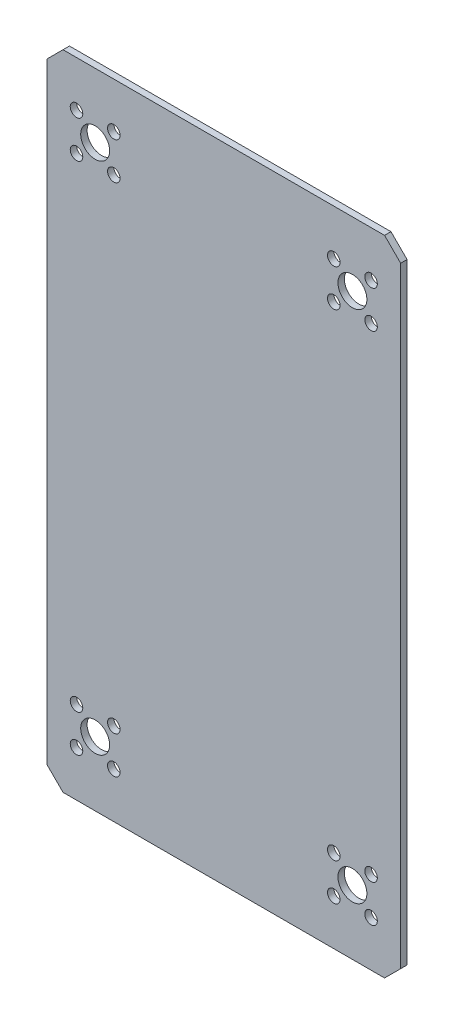
ISO-10303-21;
HEADER;
FILE_DESCRIPTION(('STEP AP214'),'2;1');
FILE_NAME('part.step','',(''),(''),'','','');
FILE_SCHEMA(('AUTOMOTIVE_DESIGN { 1 0 10303 214 1 1 1 1 }'));
ENDSEC;
DATA;
#1=APPLICATION_CONTEXT('core data for automotive mechanical design processes');
#2=APPLICATION_PROTOCOL_DEFINITION('international standard','automotive_design',2000,#1);
#3=PRODUCT_CONTEXT('',#1,'mechanical');
#4=PRODUCT('Part','Part','',(#3));
#5=PRODUCT_RELATED_PRODUCT_CATEGORY('part','',(#4));
#6=PRODUCT_DEFINITION_FORMATION('','',#4);
#7=PRODUCT_DEFINITION_CONTEXT('part definition',#1,'design');
#8=PRODUCT_DEFINITION('design','',#6,#7);
#9=PRODUCT_DEFINITION_SHAPE('','',#8);
#10=(LENGTH_UNIT() NAMED_UNIT(*) SI_UNIT(.MILLI.,.METRE.));
#11=(NAMED_UNIT(*) PLANE_ANGLE_UNIT() SI_UNIT($,.RADIAN.));
#12=(NAMED_UNIT(*) SI_UNIT($,.STERADIAN.) SOLID_ANGLE_UNIT());
#13=UNCERTAINTY_MEASURE_WITH_UNIT(LENGTH_MEASURE(1.E-05),#10,'distance_accuracy_value','');
#14=(GEOMETRIC_REPRESENTATION_CONTEXT(3) GLOBAL_UNCERTAINTY_ASSIGNED_CONTEXT((#13)) GLOBAL_UNIT_ASSIGNED_CONTEXT((#10,
#11,#12)) REPRESENTATION_CONTEXT('',''));
#15=CARTESIAN_POINT('',(0.,0.,0.));
#16=DIRECTION('',(0.,0.,1.));
#17=DIRECTION('',(1.,0.,0.));
#18=AXIS2_PLACEMENT_3D('',#15,#16,#17);
#19=CARTESIAN_POINT('',(55.,-100.,2.));
#20=DIRECTION('',(-1.,0.,0.));
#21=DIRECTION('',(0.,0.,1.));
#22=AXIS2_PLACEMENT_3D('',#19,#20,#21);
#23=PLANE('',#22);
#24=DIRECTION('',(0.,1.,0.));
#25=VECTOR('',#24,1.);
#26=CARTESIAN_POINT('',(55.,-100.,2.));
#27=LINE('',#26,#25);
#28=CARTESIAN_POINT('',(55.,-94.9999999999999,2.));
#29=VERTEX_POINT('',#28);
#30=CARTESIAN_POINT('',(55.,95.0000000000001,2.));
#31=VERTEX_POINT('',#30);
#32=EDGE_CURVE('E124',#29,#31,#27,.T.);
#33=ORIENTED_EDGE('',*,*,#32,.F.);
#34=DIRECTION('',(0.,0.,-1.));
#35=VECTOR('',#34,1.);
#36=CARTESIAN_POINT('',(55.,-94.9999999999999,2.));
#37=LINE('',#36,#35);
#38=CARTESIAN_POINT('',(55.,-94.9999999999999,0.));
#39=VERTEX_POINT('',#38);
#40=EDGE_CURVE('E150',#29,#39,#37,.T.);
#41=ORIENTED_EDGE('',*,*,#40,.T.);
#42=DIRECTION('',(0.,1.,0.));
#43=VECTOR('',#42,1.);
#44=CARTESIAN_POINT('',(55.,-100.,0.));
#45=LINE('',#44,#43);
#46=CARTESIAN_POINT('',(55.,95.0000000000001,0.));
#47=VERTEX_POINT('',#46);
#48=EDGE_CURVE('E156',#39,#47,#45,.T.);
#49=ORIENTED_EDGE('',*,*,#48,.T.);
#50=DIRECTION('',(0.,0.,1.));
#51=VECTOR('',#50,1.);
#52=CARTESIAN_POINT('',(55.,95.0000000000001,2.));
#53=LINE('',#52,#51);
#54=EDGE_CURVE('E148',#47,#31,#53,.T.);
#55=ORIENTED_EDGE('',*,*,#54,.T.);
#56=EDGE_LOOP('',(#33,#41,#49,#55));
#57=FACE_BOUND('',#56,.T.);
#58=ADVANCED_FACE('F32',(#57),#23,.F.);
#59=CARTESIAN_POINT('',(-55.,100.,2.));
#60=DIRECTION('',(0.,-1.,0.));
#61=DIRECTION('',(0.,0.,-1.));
#62=AXIS2_PLACEMENT_3D('',#59,#60,#61);
#63=PLANE('',#62);
#64=DIRECTION('',(-1.,0.,0.));
#65=VECTOR('',#64,1.);
#66=CARTESIAN_POINT('',(-55.,100.,2.));
#67=LINE('',#66,#65);
#68=CARTESIAN_POINT('',(50.,100.,2.));
#69=VERTEX_POINT('',#68);
#70=CARTESIAN_POINT('',(-49.9999999999999,100.,2.));
#71=VERTEX_POINT('',#70);
#72=EDGE_CURVE('E127',#69,#71,#67,.T.);
#73=ORIENTED_EDGE('',*,*,#72,.F.);
#74=DIRECTION('',(0.,0.,-1.));
#75=VECTOR('',#74,1.);
#76=CARTESIAN_POINT('',(50.,100.,2.));
#77=LINE('',#76,#75);
#78=CARTESIAN_POINT('',(50.,100.,0.));
#79=VERTEX_POINT('',#78);
#80=EDGE_CURVE('E11',#69,#79,#77,.T.);
#81=ORIENTED_EDGE('',*,*,#80,.T.);
#82=DIRECTION('',(-1.,0.,0.));
#83=VECTOR('',#82,1.);
#84=CARTESIAN_POINT('',(-55.,100.,0.));
#85=LINE('',#84,#83);
#86=CARTESIAN_POINT('',(-49.9999999999999,100.,0.));
#87=VERTEX_POINT('',#86);
#88=EDGE_CURVE('E129',#79,#87,#85,.T.);
#89=ORIENTED_EDGE('',*,*,#88,.T.);
#90=DIRECTION('',(0.,0.,1.));
#91=VECTOR('',#90,1.);
#92=CARTESIAN_POINT('',(-49.9999999999999,100.,2.));
#93=LINE('',#92,#91);
#94=EDGE_CURVE('E40',#87,#71,#93,.T.);
#95=ORIENTED_EDGE('',*,*,#94,.T.);
#96=EDGE_LOOP('',(#73,#81,#89,#95));
#97=FACE_BOUND('',#96,.T.);
#98=ADVANCED_FACE('F315',(#97),#63,.F.);
#99=CARTESIAN_POINT('',(-55.,-100.,2.));
#100=DIRECTION('',(1.,0.,0.));
#101=DIRECTION('',(0.,0.,-1.));
#102=AXIS2_PLACEMENT_3D('',#99,#100,#101);
#103=PLANE('',#102);
#104=DIRECTION('',(0.,-1.,0.));
#105=VECTOR('',#104,1.);
#106=CARTESIAN_POINT('',(-55.,-100.,0.));
#107=LINE('',#106,#105);
#108=CARTESIAN_POINT('',(-55.,95.,0.));
#109=VERTEX_POINT('',#108);
#110=CARTESIAN_POINT('',(-55.,-95.,0.));
#111=VERTEX_POINT('',#110);
#112=EDGE_CURVE('E125',#109,#111,#107,.T.);
#113=ORIENTED_EDGE('',*,*,#112,.T.);
#114=DIRECTION('',(0.,0.,1.));
#115=VECTOR('',#114,1.);
#116=CARTESIAN_POINT('',(-55.,-95.,2.));
#117=LINE('',#116,#115);
#118=CARTESIAN_POINT('',(-55.,-95.,2.));
#119=VERTEX_POINT('',#118);
#120=EDGE_CURVE('E103',#111,#119,#117,.T.);
#121=ORIENTED_EDGE('',*,*,#120,.T.);
#122=DIRECTION('',(0.,-1.,0.));
#123=VECTOR('',#122,1.);
#124=CARTESIAN_POINT('',(-55.,-100.,2.));
#125=LINE('',#124,#123);
#126=CARTESIAN_POINT('',(-55.,95.,2.));
#127=VERTEX_POINT('',#126);
#128=EDGE_CURVE('E168',#127,#119,#125,.T.);
#129=ORIENTED_EDGE('',*,*,#128,.F.);
#130=DIRECTION('',(0.,0.,-1.));
#131=VECTOR('',#130,1.);
#132=CARTESIAN_POINT('',(-55.,95.,2.));
#133=LINE('',#132,#131);
#134=EDGE_CURVE('E108',#127,#109,#133,.T.);
#135=ORIENTED_EDGE('',*,*,#134,.T.);
#136=EDGE_LOOP('',(#113,#121,#129,#135));
#137=FACE_BOUND('',#136,.T.);
#138=ADVANCED_FACE('F313',(#137),#103,.F.);
#139=CARTESIAN_POINT('',(-55.,-100.,2.));
#140=DIRECTION('',(0.,1.,0.));
#141=DIRECTION('',(0.,0.,1.));
#142=AXIS2_PLACEMENT_3D('',#139,#140,#141);
#143=PLANE('',#142);
#144=DIRECTION('',(1.,0.,0.));
#145=VECTOR('',#144,1.);
#146=CARTESIAN_POINT('',(-55.,-100.,2.));
#147=LINE('',#146,#145);
#148=CARTESIAN_POINT('',(-50.,-100.,2.));
#149=VERTEX_POINT('',#148);
#150=CARTESIAN_POINT('',(50.,-100.,2.));
#151=VERTEX_POINT('',#150);
#152=EDGE_CURVE('E118',#149,#151,#147,.T.);
#153=ORIENTED_EDGE('',*,*,#152,.F.);
#154=DIRECTION('',(0.,0.,-1.));
#155=VECTOR('',#154,1.);
#156=CARTESIAN_POINT('',(-50.,-100.,2.));
#157=LINE('',#156,#155);
#158=CARTESIAN_POINT('',(-50.,-100.,0.));
#159=VERTEX_POINT('',#158);
#160=EDGE_CURVE('E102',#149,#159,#157,.T.);
#161=ORIENTED_EDGE('',*,*,#160,.T.);
#162=DIRECTION('',(1.,0.,0.));
#163=VECTOR('',#162,1.);
#164=CARTESIAN_POINT('',(-55.,-100.,0.));
#165=LINE('',#164,#163);
#166=CARTESIAN_POINT('',(50.,-100.,0.));
#167=VERTEX_POINT('',#166);
#168=EDGE_CURVE('E115',#159,#167,#165,.T.);
#169=ORIENTED_EDGE('',*,*,#168,.T.);
#170=DIRECTION('',(0.,0.,1.));
#171=VECTOR('',#170,1.);
#172=CARTESIAN_POINT('',(50.,-100.,2.));
#173=LINE('',#172,#171);
#174=EDGE_CURVE('E120',#167,#151,#173,.T.);
#175=ORIENTED_EDGE('',*,*,#174,.T.);
#176=EDGE_LOOP('',(#153,#161,#169,#175));
#177=FACE_BOUND('',#176,.T.);
#178=ADVANCED_FACE('F114',(#177),#143,.F.);
#179=CARTESIAN_POINT('',(0.,0.,2.));
#180=DIRECTION('',(0.,0.,-1.));
#181=DIRECTION('',(-1.,0.,0.));
#182=AXIS2_PLACEMENT_3D('',#179,#180,#181);
#183=PLANE('',#182);
#184=CARTESIAN_POINT('',(45.8,-74.2,2.));
#185=DIRECTION('',(0.,0.,1.));
#186=DIRECTION('',(-1.,0.,0.));
#187=AXIS2_PLACEMENT_3D('',#184,#185,#186);
#188=CIRCLE('',#187,1.94999999999998);
#189=CARTESIAN_POINT('',(43.85,-74.2,2.));
#190=VERTEX_POINT('',#189);
#191=EDGE_CURVE('E235',#190,#190,#188,.T.);
#192=ORIENTED_EDGE('',*,*,#191,.F.);
#193=EDGE_LOOP('',(#192));
#194=FACE_BOUND('',#193,.T.);
#195=CARTESIAN_POINT('',(45.8,-85.8,2.));
#196=DIRECTION('',(0.,0.,1.));
#197=DIRECTION('',(1.,0.,0.));
#198=AXIS2_PLACEMENT_3D('',#195,#196,#197);
#199=CIRCLE('',#198,1.94999999999998);
#200=CARTESIAN_POINT('',(47.75,-85.8,2.));
#201=VERTEX_POINT('',#200);
#202=EDGE_CURVE('E242',#201,#201,#199,.T.);
#203=ORIENTED_EDGE('',*,*,#202,.F.);
#204=EDGE_LOOP('',(#203));
#205=FACE_BOUND('',#204,.T.);
#206=CARTESIAN_POINT('',(40.,-80.,2.));
#207=DIRECTION('',(0.,0.,1.));
#208=DIRECTION('',(1.,0.,0.));
#209=AXIS2_PLACEMENT_3D('',#206,#207,#208);
#210=CIRCLE('',#209,4.5);
#211=CARTESIAN_POINT('',(44.5,-80.,2.));
#212=VERTEX_POINT('',#211);
#213=EDGE_CURVE('E223',#212,#212,#210,.T.);
#214=ORIENTED_EDGE('',*,*,#213,.F.);
#215=EDGE_LOOP('',(#214));
#216=FACE_BOUND('',#215,.T.);
#217=CARTESIAN_POINT('',(40.,80.,2.));
#218=DIRECTION('',(0.,0.,1.));
#219=DIRECTION('',(-1.,0.,0.));
#220=AXIS2_PLACEMENT_3D('',#217,#218,#219);
#221=CIRCLE('',#220,4.5);
#222=CARTESIAN_POINT('',(35.5,80.,2.));
#223=VERTEX_POINT('',#222);
#224=EDGE_CURVE('E230',#223,#223,#221,.T.);
#225=ORIENTED_EDGE('',*,*,#224,.F.);
#226=EDGE_LOOP('',(#225));
#227=FACE_BOUND('',#226,.T.);
#228=CARTESIAN_POINT('',(34.2,-74.2,2.));
#229=DIRECTION('',(0.,0.,1.));
#230=DIRECTION('',(1.,0.,0.));
#231=AXIS2_PLACEMENT_3D('',#228,#229,#230);
#232=CIRCLE('',#231,1.94999999999999);
#233=CARTESIAN_POINT('',(36.15,-74.2,2.));
#234=VERTEX_POINT('',#233);
#235=EDGE_CURVE('E266',#234,#234,#232,.T.);
#236=ORIENTED_EDGE('',*,*,#235,.F.);
#237=EDGE_LOOP('',(#236));
#238=FACE_BOUND('',#237,.T.);
#239=CARTESIAN_POINT('',(34.2,-85.8,2.));
#240=DIRECTION('',(0.,0.,1.));
#241=DIRECTION('',(-1.,0.,0.));
#242=AXIS2_PLACEMENT_3D('',#239,#240,#241);
#243=CIRCLE('',#242,1.94999999999999);
#244=CARTESIAN_POINT('',(32.25,-85.8,2.));
#245=VERTEX_POINT('',#244);
#246=EDGE_CURVE('E260',#245,#245,#243,.T.);
#247=ORIENTED_EDGE('',*,*,#246,.F.);
#248=EDGE_LOOP('',(#247));
#249=FACE_BOUND('',#248,.T.);
#250=CARTESIAN_POINT('',(-34.2,-85.8,2.));
#251=DIRECTION('',(0.,0.,1.));
#252=DIRECTION('',(1.,0.,0.));
#253=AXIS2_PLACEMENT_3D('',#250,#251,#252);
#254=CIRCLE('',#253,1.94999999999999);
#255=CARTESIAN_POINT('',(-32.25,-85.8,2.));
#256=VERTEX_POINT('',#255);
#257=EDGE_CURVE('E254',#256,#256,#254,.T.);
#258=ORIENTED_EDGE('',*,*,#257,.F.);
#259=EDGE_LOOP('',(#258));
#260=FACE_BOUND('',#259,.T.);
#261=CARTESIAN_POINT('',(-34.2,-74.2,2.));
#262=DIRECTION('',(0.,0.,1.));
#263=DIRECTION('',(-1.,0.,0.));
#264=AXIS2_PLACEMENT_3D('',#261,#262,#263);
#265=CIRCLE('',#264,1.94999999999999);
#266=CARTESIAN_POINT('',(-36.15,-74.2,2.));
#267=VERTEX_POINT('',#266);
#268=EDGE_CURVE('E247',#267,#267,#265,.T.);
#269=ORIENTED_EDGE('',*,*,#268,.F.);
#270=EDGE_LOOP('',(#269));
#271=FACE_BOUND('',#270,.T.);
#272=CARTESIAN_POINT('',(45.8,85.8,2.));
#273=DIRECTION('',(0.,0.,1.));
#274=DIRECTION('',(-1.,0.,0.));
#275=AXIS2_PLACEMENT_3D('',#272,#273,#274);
#276=CIRCLE('',#275,1.94999999999998);
#277=CARTESIAN_POINT('',(43.85,85.8,2.));
#278=VERTEX_POINT('',#277);
#279=EDGE_CURVE('E175',#278,#278,#276,.T.);
#280=ORIENTED_EDGE('',*,*,#279,.F.);
#281=EDGE_LOOP('',(#280));
#282=FACE_BOUND('',#281,.T.);
#283=CARTESIAN_POINT('',(45.8,74.2,2.));
#284=DIRECTION('',(0.,0.,1.));
#285=DIRECTION('',(1.,0.,0.));
#286=AXIS2_PLACEMENT_3D('',#283,#284,#285);
#287=CIRCLE('',#286,1.94999999999998);
#288=CARTESIAN_POINT('',(47.75,74.2,2.));
#289=VERTEX_POINT('',#288);
#290=EDGE_CURVE('E182',#289,#289,#287,.T.);
#291=ORIENTED_EDGE('',*,*,#290,.F.);
#292=EDGE_LOOP('',(#291));
#293=FACE_BOUND('',#292,.T.);
#294=CARTESIAN_POINT('',(34.2,74.2,2.));
#295=DIRECTION('',(0.,0.,1.));
#296=DIRECTION('',(-1.,0.,0.));
#297=AXIS2_PLACEMENT_3D('',#294,#295,#296);
#298=CIRCLE('',#297,1.94999999999999);
#299=CARTESIAN_POINT('',(32.25,74.2,2.));
#300=VERTEX_POINT('',#299);
#301=EDGE_CURVE('E188',#300,#300,#298,.T.);
#302=ORIENTED_EDGE('',*,*,#301,.F.);
#303=EDGE_LOOP('',(#302));
#304=FACE_BOUND('',#303,.T.);
#305=CARTESIAN_POINT('',(34.2,85.8,2.));
#306=DIRECTION('',(0.,0.,1.));
#307=DIRECTION('',(1.,0.,0.));
#308=AXIS2_PLACEMENT_3D('',#305,#306,#307);
#309=CIRCLE('',#308,1.94999999999999);
#310=CARTESIAN_POINT('',(36.15,85.8,2.));
#311=VERTEX_POINT('',#310);
#312=EDGE_CURVE('E194',#311,#311,#309,.T.);
#313=ORIENTED_EDGE('',*,*,#312,.F.);
#314=EDGE_LOOP('',(#313));
#315=FACE_BOUND('',#314,.T.);
#316=CARTESIAN_POINT('',(-34.2,85.8,2.));
#317=DIRECTION('',(0.,0.,1.));
#318=DIRECTION('',(-1.,0.,0.));
#319=AXIS2_PLACEMENT_3D('',#316,#317,#318);
#320=CIRCLE('',#319,1.94999999999999);
#321=CARTESIAN_POINT('',(-36.15,85.8,2.));
#322=VERTEX_POINT('',#321);
#323=EDGE_CURVE('E200',#322,#322,#320,.T.);
#324=ORIENTED_EDGE('',*,*,#323,.F.);
#325=EDGE_LOOP('',(#324));
#326=FACE_BOUND('',#325,.T.);
#327=CARTESIAN_POINT('',(-34.2,74.2,2.));
#328=DIRECTION('',(0.,0.,1.));
#329=DIRECTION('',(1.,0.,0.));
#330=AXIS2_PLACEMENT_3D('',#327,#328,#329);
#331=CIRCLE('',#330,1.94999999999999);
#332=CARTESIAN_POINT('',(-32.25,74.2,2.));
#333=VERTEX_POINT('',#332);
#334=EDGE_CURVE('E206',#333,#333,#331,.T.);
#335=ORIENTED_EDGE('',*,*,#334,.F.);
#336=EDGE_LOOP('',(#335));
#337=FACE_BOUND('',#336,.T.);
#338=CARTESIAN_POINT('',(-45.8,74.2,2.));
#339=DIRECTION('',(0.,0.,1.));
#340=DIRECTION('',(-1.,0.,0.));
#341=AXIS2_PLACEMENT_3D('',#338,#339,#340);
#342=CIRCLE('',#341,1.94999999999998);
#343=CARTESIAN_POINT('',(-47.75,74.2,2.));
#344=VERTEX_POINT('',#343);
#345=EDGE_CURVE('E212',#344,#344,#342,.T.);
#346=ORIENTED_EDGE('',*,*,#345,.F.);
#347=EDGE_LOOP('',(#346));
#348=FACE_BOUND('',#347,.T.);
#349=CARTESIAN_POINT('',(-45.8,85.8,2.));
#350=DIRECTION('',(0.,0.,1.));
#351=DIRECTION('',(1.,0.,0.));
#352=AXIS2_PLACEMENT_3D('',#349,#350,#351);
#353=CIRCLE('',#352,1.94999999999998);
#354=CARTESIAN_POINT('',(-43.85,85.8,2.));
#355=VERTEX_POINT('',#354);
#356=EDGE_CURVE('E218',#355,#355,#353,.T.);
#357=ORIENTED_EDGE('',*,*,#356,.F.);
#358=EDGE_LOOP('',(#357));
#359=FACE_BOUND('',#358,.T.);
#360=CARTESIAN_POINT('',(-40.,-80.,2.));
#361=DIRECTION('',(0.,0.,1.));
#362=DIRECTION('',(-1.,0.,0.));
#363=AXIS2_PLACEMENT_3D('',#360,#361,#362);
#364=CIRCLE('',#363,4.50000000000001);
#365=CARTESIAN_POINT('',(-44.5000000000001,-80.,2.));
#366=VERTEX_POINT('',#365);
#367=EDGE_CURVE('E283',#366,#366,#364,.T.);
#368=ORIENTED_EDGE('',*,*,#367,.F.);
#369=EDGE_LOOP('',(#368));
#370=FACE_BOUND('',#369,.T.);
#371=CARTESIAN_POINT('',(-45.8,-85.8,2.));
#372=DIRECTION('',(0.,0.,1.));
#373=DIRECTION('',(-1.,0.,0.));
#374=AXIS2_PLACEMENT_3D('',#371,#372,#373);
#375=CIRCLE('',#374,1.94999999999998);
#376=CARTESIAN_POINT('',(-47.75,-85.8,2.));
#377=VERTEX_POINT('',#376);
#378=EDGE_CURVE('E271',#377,#377,#375,.T.);
#379=ORIENTED_EDGE('',*,*,#378,.F.);
#380=EDGE_LOOP('',(#379));
#381=FACE_BOUND('',#380,.T.);
#382=CARTESIAN_POINT('',(-45.8,-74.2,2.));
#383=DIRECTION('',(0.,0.,1.));
#384=DIRECTION('',(1.,0.,0.));
#385=AXIS2_PLACEMENT_3D('',#382,#383,#384);
#386=CIRCLE('',#385,1.94999999999998);
#387=CARTESIAN_POINT('',(-43.85,-74.2,2.));
#388=VERTEX_POINT('',#387);
#389=EDGE_CURVE('E278',#388,#388,#386,.T.);
#390=ORIENTED_EDGE('',*,*,#389,.F.);
#391=EDGE_LOOP('',(#390));
#392=FACE_BOUND('',#391,.T.);
#393=CARTESIAN_POINT('',(-40.,80.,2.));
#394=DIRECTION('',(0.,0.,1.));
#395=DIRECTION('',(1.,0.,0.));
#396=AXIS2_PLACEMENT_3D('',#393,#394,#395);
#397=CIRCLE('',#396,4.50000000000001);
#398=CARTESIAN_POINT('',(-35.5,80.,2.));
#399=VERTEX_POINT('',#398);
#400=EDGE_CURVE('E164',#399,#399,#397,.T.);
#401=ORIENTED_EDGE('',*,*,#400,.F.);
#402=EDGE_LOOP('',(#401));
#403=FACE_BOUND('',#402,.T.);
#404=ORIENTED_EDGE('',*,*,#128,.T.);
#405=DIRECTION('',(-0.707106781186548,0.707106781186548,0.));
#406=VECTOR('',#405,1.);
#407=CARTESIAN_POINT('',(-50.,-100.,2.));
#408=LINE('',#407,#406);
#409=EDGE_CURVE('E146',#119,#149,#408,.F.);
#410=ORIENTED_EDGE('',*,*,#409,.T.);
#411=ORIENTED_EDGE('',*,*,#152,.T.);
#412=DIRECTION('',(-0.707106781186548,-0.707106781186548,0.));
#413=VECTOR('',#412,1.);
#414=CARTESIAN_POINT('',(55.,-94.9999999999999,2.));
#415=LINE('',#414,#413);
#416=EDGE_CURVE('E144',#151,#29,#415,.F.);
#417=ORIENTED_EDGE('',*,*,#416,.T.);
#418=ORIENTED_EDGE('',*,*,#32,.T.);
#419=DIRECTION('',(0.707106781186548,-0.707106781186548,0.));
#420=VECTOR('',#419,1.);
#421=CARTESIAN_POINT('',(50.,100.,2.));
#422=LINE('',#421,#420);
#423=EDGE_CURVE('E53',#31,#69,#422,.F.);
#424=ORIENTED_EDGE('',*,*,#423,.T.);
#425=ORIENTED_EDGE('',*,*,#72,.T.);
#426=DIRECTION('',(0.707106781186548,0.707106781186548,0.));
#427=VECTOR('',#426,1.);
#428=CARTESIAN_POINT('',(-55.,95.,2.));
#429=LINE('',#428,#427);
#430=EDGE_CURVE('E141',#71,#127,#429,.F.);
#431=ORIENTED_EDGE('',*,*,#430,.T.);
#432=EDGE_LOOP('',(#404,#410,#411,#417,#418,#424,#425,#431));
#433=FACE_BOUND('',#432,.T.);
#434=ADVANCED_FACE('F299',(#194,#205,#216,#227,#238,#249,#260,#271,#282,#293,#304,#315,#326,
#337,#348,#359,#370,#381,#392,#403,#433),#183,.F.);
#435=CARTESIAN_POINT('',(0.,0.,0.));
#436=DIRECTION('',(0.,0.,-1.));
#437=DIRECTION('',(-1.,0.,0.));
#438=AXIS2_PLACEMENT_3D('',#435,#436,#437);
#439=PLANE('',#438);
#440=CARTESIAN_POINT('',(45.8,-74.2,0.));
#441=DIRECTION('',(0.,0.,1.));
#442=DIRECTION('',(-1.,0.,0.));
#443=AXIS2_PLACEMENT_3D('',#440,#441,#442);
#444=CIRCLE('',#443,1.94999999999998);
#445=CARTESIAN_POINT('',(43.85,-74.2,0.));
#446=VERTEX_POINT('',#445);
#447=EDGE_CURVE('E238',#446,#446,#444,.T.);
#448=ORIENTED_EDGE('',*,*,#447,.T.);
#449=EDGE_LOOP('',(#448));
#450=FACE_BOUND('',#449,.T.);
#451=CARTESIAN_POINT('',(45.8,-85.8,0.));
#452=DIRECTION('',(0.,0.,1.));
#453=DIRECTION('',(1.,0.,0.));
#454=AXIS2_PLACEMENT_3D('',#451,#452,#453);
#455=CIRCLE('',#454,1.94999999999998);
#456=CARTESIAN_POINT('',(47.75,-85.8,0.));
#457=VERTEX_POINT('',#456);
#458=EDGE_CURVE('E227',#457,#457,#455,.T.);
#459=ORIENTED_EDGE('',*,*,#458,.T.);
#460=EDGE_LOOP('',(#459));
#461=FACE_BOUND('',#460,.T.);
#462=CARTESIAN_POINT('',(40.,-80.,0.));
#463=DIRECTION('',(0.,0.,1.));
#464=DIRECTION('',(1.,0.,0.));
#465=AXIS2_PLACEMENT_3D('',#462,#463,#464);
#466=CIRCLE('',#465,4.5);
#467=CARTESIAN_POINT('',(44.5,-80.,0.));
#468=VERTEX_POINT('',#467);
#469=EDGE_CURVE('E226',#468,#468,#466,.T.);
#470=ORIENTED_EDGE('',*,*,#469,.T.);
#471=EDGE_LOOP('',(#470));
#472=FACE_BOUND('',#471,.T.);
#473=CARTESIAN_POINT('',(40.,80.,0.));
#474=DIRECTION('',(0.,0.,1.));
#475=DIRECTION('',(-1.,0.,0.));
#476=AXIS2_PLACEMENT_3D('',#473,#474,#475);
#477=CIRCLE('',#476,4.5);
#478=CARTESIAN_POINT('',(35.5,80.,0.));
#479=VERTEX_POINT('',#478);
#480=EDGE_CURVE('E179',#479,#479,#477,.T.);
#481=ORIENTED_EDGE('',*,*,#480,.T.);
#482=EDGE_LOOP('',(#481));
#483=FACE_BOUND('',#482,.T.);
#484=CARTESIAN_POINT('',(34.2,-74.2,0.));
#485=DIRECTION('',(0.,0.,1.));
#486=DIRECTION('',(1.,0.,0.));
#487=AXIS2_PLACEMENT_3D('',#484,#485,#486);
#488=CIRCLE('',#487,1.94999999999999);
#489=CARTESIAN_POINT('',(36.15,-74.2,0.));
#490=VERTEX_POINT('',#489);
#491=EDGE_CURVE('E239',#490,#490,#488,.T.);
#492=ORIENTED_EDGE('',*,*,#491,.T.);
#493=EDGE_LOOP('',(#492));
#494=FACE_BOUND('',#493,.T.);
#495=CARTESIAN_POINT('',(34.2,-85.8,0.));
#496=DIRECTION('',(0.,0.,1.));
#497=DIRECTION('',(-1.,0.,0.));
#498=AXIS2_PLACEMENT_3D('',#495,#496,#497);
#499=CIRCLE('',#498,1.94999999999999);
#500=CARTESIAN_POINT('',(32.25,-85.8,0.));
#501=VERTEX_POINT('',#500);
#502=EDGE_CURVE('E263',#501,#501,#499,.T.);
#503=ORIENTED_EDGE('',*,*,#502,.T.);
#504=EDGE_LOOP('',(#503));
#505=FACE_BOUND('',#504,.T.);
#506=CARTESIAN_POINT('',(-34.2,-85.8,0.));
#507=DIRECTION('',(0.,0.,1.));
#508=DIRECTION('',(1.,0.,0.));
#509=AXIS2_PLACEMENT_3D('',#506,#507,#508);
#510=CIRCLE('',#509,1.94999999999999);
#511=CARTESIAN_POINT('',(-32.25,-85.8,0.));
#512=VERTEX_POINT('',#511);
#513=EDGE_CURVE('E257',#512,#512,#510,.T.);
#514=ORIENTED_EDGE('',*,*,#513,.T.);
#515=EDGE_LOOP('',(#514));
#516=FACE_BOUND('',#515,.T.);
#517=CARTESIAN_POINT('',(-34.2,-74.2,0.));
#518=DIRECTION('',(0.,0.,1.));
#519=DIRECTION('',(-1.,0.,0.));
#520=AXIS2_PLACEMENT_3D('',#517,#518,#519);
#521=CIRCLE('',#520,1.94999999999999);
#522=CARTESIAN_POINT('',(-36.15,-74.2,0.));
#523=VERTEX_POINT('',#522);
#524=EDGE_CURVE('E250',#523,#523,#521,.T.);
#525=ORIENTED_EDGE('',*,*,#524,.T.);
#526=EDGE_LOOP('',(#525));
#527=FACE_BOUND('',#526,.T.);
#528=CARTESIAN_POINT('',(45.8,85.8,0.));
#529=DIRECTION('',(0.,0.,1.));
#530=DIRECTION('',(-1.,0.,0.));
#531=AXIS2_PLACEMENT_3D('',#528,#529,#530);
#532=CIRCLE('',#531,1.94999999999998);
#533=CARTESIAN_POINT('',(43.85,85.8,0.));
#534=VERTEX_POINT('',#533);
#535=EDGE_CURVE('E178',#534,#534,#532,.T.);
#536=ORIENTED_EDGE('',*,*,#535,.T.);
#537=EDGE_LOOP('',(#536));
#538=FACE_BOUND('',#537,.T.);
#539=CARTESIAN_POINT('',(45.8,74.2,0.));
#540=DIRECTION('',(0.,0.,1.));
#541=DIRECTION('',(1.,0.,0.));
#542=AXIS2_PLACEMENT_3D('',#539,#540,#541);
#543=CIRCLE('',#542,1.94999999999998);
#544=CARTESIAN_POINT('',(47.75,74.2,0.));
#545=VERTEX_POINT('',#544);
#546=EDGE_CURVE('E185',#545,#545,#543,.T.);
#547=ORIENTED_EDGE('',*,*,#546,.T.);
#548=EDGE_LOOP('',(#547));
#549=FACE_BOUND('',#548,.T.);
#550=CARTESIAN_POINT('',(34.2,74.2,0.));
#551=DIRECTION('',(0.,0.,1.));
#552=DIRECTION('',(-1.,0.,0.));
#553=AXIS2_PLACEMENT_3D('',#550,#551,#552);
#554=CIRCLE('',#553,1.94999999999999);
#555=CARTESIAN_POINT('',(32.25,74.2,0.));
#556=VERTEX_POINT('',#555);
#557=EDGE_CURVE('E191',#556,#556,#554,.T.);
#558=ORIENTED_EDGE('',*,*,#557,.T.);
#559=EDGE_LOOP('',(#558));
#560=FACE_BOUND('',#559,.T.);
#561=CARTESIAN_POINT('',(34.2,85.8,0.));
#562=DIRECTION('',(0.,0.,1.));
#563=DIRECTION('',(1.,0.,0.));
#564=AXIS2_PLACEMENT_3D('',#561,#562,#563);
#565=CIRCLE('',#564,1.94999999999999);
#566=CARTESIAN_POINT('',(36.15,85.8,0.));
#567=VERTEX_POINT('',#566);
#568=EDGE_CURVE('E197',#567,#567,#565,.T.);
#569=ORIENTED_EDGE('',*,*,#568,.T.);
#570=EDGE_LOOP('',(#569));
#571=FACE_BOUND('',#570,.T.);
#572=CARTESIAN_POINT('',(-34.2,85.8,0.));
#573=DIRECTION('',(0.,0.,1.));
#574=DIRECTION('',(-1.,0.,0.));
#575=AXIS2_PLACEMENT_3D('',#572,#573,#574);
#576=CIRCLE('',#575,1.94999999999999);
#577=CARTESIAN_POINT('',(-36.15,85.8,0.));
#578=VERTEX_POINT('',#577);
#579=EDGE_CURVE('E203',#578,#578,#576,.T.);
#580=ORIENTED_EDGE('',*,*,#579,.T.);
#581=EDGE_LOOP('',(#580));
#582=FACE_BOUND('',#581,.T.);
#583=CARTESIAN_POINT('',(-34.2,74.2,0.));
#584=DIRECTION('',(0.,0.,1.));
#585=DIRECTION('',(1.,0.,0.));
#586=AXIS2_PLACEMENT_3D('',#583,#584,#585);
#587=CIRCLE('',#586,1.94999999999999);
#588=CARTESIAN_POINT('',(-32.25,74.2,0.));
#589=VERTEX_POINT('',#588);
#590=EDGE_CURVE('E209',#589,#589,#587,.T.);
#591=ORIENTED_EDGE('',*,*,#590,.T.);
#592=EDGE_LOOP('',(#591));
#593=FACE_BOUND('',#592,.T.);
#594=CARTESIAN_POINT('',(-45.8,74.2,0.));
#595=DIRECTION('',(0.,0.,1.));
#596=DIRECTION('',(-1.,0.,0.));
#597=AXIS2_PLACEMENT_3D('',#594,#595,#596);
#598=CIRCLE('',#597,1.94999999999998);
#599=CARTESIAN_POINT('',(-47.75,74.2,0.));
#600=VERTEX_POINT('',#599);
#601=EDGE_CURVE('E215',#600,#600,#598,.T.);
#602=ORIENTED_EDGE('',*,*,#601,.T.);
#603=EDGE_LOOP('',(#602));
#604=FACE_BOUND('',#603,.T.);
#605=CARTESIAN_POINT('',(-45.8,85.8,0.));
#606=DIRECTION('',(0.,0.,1.));
#607=DIRECTION('',(1.,0.,0.));
#608=AXIS2_PLACEMENT_3D('',#605,#606,#607);
#609=CIRCLE('',#608,1.94999999999998);
#610=CARTESIAN_POINT('',(-43.85,85.8,0.));
#611=VERTEX_POINT('',#610);
#612=EDGE_CURVE('E173',#611,#611,#609,.T.);
#613=ORIENTED_EDGE('',*,*,#612,.T.);
#614=EDGE_LOOP('',(#613));
#615=FACE_BOUND('',#614,.T.);
#616=CARTESIAN_POINT('',(-40.,-80.,0.));
#617=DIRECTION('',(0.,0.,1.));
#618=DIRECTION('',(-1.,0.,0.));
#619=AXIS2_PLACEMENT_3D('',#616,#617,#618);
#620=CIRCLE('',#619,4.50000000000001);
#621=CARTESIAN_POINT('',(-44.5000000000001,-80.,0.));
#622=VERTEX_POINT('',#621);
#623=EDGE_CURVE('E275',#622,#622,#620,.T.);
#624=ORIENTED_EDGE('',*,*,#623,.T.);
#625=EDGE_LOOP('',(#624));
#626=FACE_BOUND('',#625,.T.);
#627=CARTESIAN_POINT('',(-45.8,-85.8,0.));
#628=DIRECTION('',(0.,0.,1.));
#629=DIRECTION('',(-1.,0.,0.));
#630=AXIS2_PLACEMENT_3D('',#627,#628,#629);
#631=CIRCLE('',#630,1.94999999999998);
#632=CARTESIAN_POINT('',(-47.75,-85.8,0.));
#633=VERTEX_POINT('',#632);
#634=EDGE_CURVE('E274',#633,#633,#631,.T.);
#635=ORIENTED_EDGE('',*,*,#634,.T.);
#636=EDGE_LOOP('',(#635));
#637=FACE_BOUND('',#636,.T.);
#638=CARTESIAN_POINT('',(-45.8,-74.2,0.));
#639=DIRECTION('',(0.,0.,1.));
#640=DIRECTION('',(1.,0.,0.));
#641=AXIS2_PLACEMENT_3D('',#638,#639,#640);
#642=CIRCLE('',#641,1.94999999999998);
#643=CARTESIAN_POINT('',(-43.85,-74.2,0.));
#644=VERTEX_POINT('',#643);
#645=EDGE_CURVE('E251',#644,#644,#642,.T.);
#646=ORIENTED_EDGE('',*,*,#645,.T.);
#647=EDGE_LOOP('',(#646));
#648=FACE_BOUND('',#647,.T.);
#649=CARTESIAN_POINT('',(-40.,80.,0.));
#650=DIRECTION('',(0.,0.,1.));
#651=DIRECTION('',(1.,0.,0.));
#652=AXIS2_PLACEMENT_3D('',#649,#650,#651);
#653=CIRCLE('',#652,4.50000000000001);
#654=CARTESIAN_POINT('',(-35.5,80.,0.));
#655=VERTEX_POINT('',#654);
#656=EDGE_CURVE('E161',#655,#655,#653,.T.);
#657=ORIENTED_EDGE('',*,*,#656,.T.);
#658=EDGE_LOOP('',(#657));
#659=FACE_BOUND('',#658,.T.);
#660=ORIENTED_EDGE('',*,*,#168,.F.);
#661=DIRECTION('',(0.707106781186548,-0.707106781186548,0.));
#662=VECTOR('',#661,1.);
#663=CARTESIAN_POINT('',(-75.,-75.,0.));
#664=LINE('',#663,#662);
#665=EDGE_CURVE('E98',#159,#111,#664,.F.);
#666=ORIENTED_EDGE('',*,*,#665,.T.);
#667=ORIENTED_EDGE('',*,*,#112,.F.);
#668=DIRECTION('',(-0.707106781186548,-0.707106781186548,0.));
#669=VECTOR('',#668,1.);
#670=CARTESIAN_POINT('',(-75.,75.,0.));
#671=LINE('',#670,#669);
#672=EDGE_CURVE('E119',#109,#87,#671,.F.);
#673=ORIENTED_EDGE('',*,*,#672,.T.);
#674=ORIENTED_EDGE('',*,*,#88,.F.);
#675=DIRECTION('',(-0.707106781186548,0.707106781186548,0.));
#676=VECTOR('',#675,1.);
#677=CARTESIAN_POINT('',(75.,75.,0.));
#678=LINE('',#677,#676);
#679=EDGE_CURVE('E135',#79,#47,#678,.F.);
#680=ORIENTED_EDGE('',*,*,#679,.T.);
#681=ORIENTED_EDGE('',*,*,#48,.F.);
#682=DIRECTION('',(0.707106781186548,0.707106781186548,0.));
#683=VECTOR('',#682,1.);
#684=CARTESIAN_POINT('',(75.,-75.,0.));
#685=LINE('',#684,#683);
#686=EDGE_CURVE('E109',#39,#167,#685,.F.);
#687=ORIENTED_EDGE('',*,*,#686,.T.);
#688=EDGE_LOOP('',(#660,#666,#667,#673,#674,#680,#681,#687));
#689=FACE_BOUND('',#688,.T.);
#690=ADVANCED_FACE('F122',(#450,#461,#472,#483,#494,#505,#516,#527,#538,#549,#560,#571,#582,
#593,#604,#615,#626,#637,#648,#659,#689),#439,.T.);
#691=CARTESIAN_POINT('',(-40.,80.,0.));
#692=DIRECTION('',(0.,0.,1.));
#693=DIRECTION('',(1.,0.,0.));
#694=AXIS2_PLACEMENT_3D('',#691,#692,#693);
#695=CYLINDRICAL_SURFACE('',#694,4.50000000000001);
#696=ORIENTED_EDGE('',*,*,#656,.F.);
#697=EDGE_LOOP('',(#696));
#698=FACE_BOUND('',#697,.T.);
#699=ORIENTED_EDGE('',*,*,#400,.T.);
#700=EDGE_LOOP('',(#699));
#701=FACE_BOUND('',#700,.T.);
#702=ADVANCED_FACE('F340',(#698,#701),#695,.F.);
#703=CARTESIAN_POINT('',(-45.8,-74.2,0.));
#704=DIRECTION('',(0.,0.,1.));
#705=DIRECTION('',(1.,0.,0.));
#706=AXIS2_PLACEMENT_3D('',#703,#704,#705);
#707=CYLINDRICAL_SURFACE('',#706,1.94999999999998);
#708=ORIENTED_EDGE('',*,*,#645,.F.);
#709=EDGE_LOOP('',(#708));
#710=FACE_BOUND('',#709,.T.);
#711=ORIENTED_EDGE('',*,*,#389,.T.);
#712=EDGE_LOOP('',(#711));
#713=FACE_BOUND('',#712,.T.);
#714=ADVANCED_FACE('F345',(#710,#713),#707,.F.);
#715=CARTESIAN_POINT('',(-45.8,-85.8,0.));
#716=DIRECTION('',(0.,0.,1.));
#717=DIRECTION('',(1.,0.,0.));
#718=AXIS2_PLACEMENT_3D('',#715,#716,#717);
#719=CYLINDRICAL_SURFACE('',#718,1.94999999999998);
#720=ORIENTED_EDGE('',*,*,#634,.F.);
#721=EDGE_LOOP('',(#720));
#722=FACE_BOUND('',#721,.T.);
#723=ORIENTED_EDGE('',*,*,#378,.T.);
#724=EDGE_LOOP('',(#723));
#725=FACE_BOUND('',#724,.T.);
#726=ADVANCED_FACE('F295',(#722,#725),#719,.F.);
#727=CARTESIAN_POINT('',(-40.,-80.,0.));
#728=DIRECTION('',(0.,0.,1.));
#729=DIRECTION('',(1.,0.,0.));
#730=AXIS2_PLACEMENT_3D('',#727,#728,#729);
#731=CYLINDRICAL_SURFACE('',#730,4.50000000000001);
#732=ORIENTED_EDGE('',*,*,#623,.F.);
#733=EDGE_LOOP('',(#732));
#734=FACE_BOUND('',#733,.T.);
#735=ORIENTED_EDGE('',*,*,#367,.T.);
#736=EDGE_LOOP('',(#735));
#737=FACE_BOUND('',#736,.T.);
#738=ADVANCED_FACE('F291',(#734,#737),#731,.F.);
#739=CARTESIAN_POINT('',(-45.8,85.8,0.));
#740=DIRECTION('',(0.,0.,1.));
#741=DIRECTION('',(1.,0.,0.));
#742=AXIS2_PLACEMENT_3D('',#739,#740,#741);
#743=CYLINDRICAL_SURFACE('',#742,1.94999999999998);
#744=ORIENTED_EDGE('',*,*,#612,.F.);
#745=EDGE_LOOP('',(#744));
#746=FACE_BOUND('',#745,.T.);
#747=ORIENTED_EDGE('',*,*,#356,.T.);
#748=EDGE_LOOP('',(#747));
#749=FACE_BOUND('',#748,.T.);
#750=ADVANCED_FACE('F294',(#746,#749),#743,.F.);
#751=CARTESIAN_POINT('',(-45.8,74.2,0.));
#752=DIRECTION('',(0.,0.,1.));
#753=DIRECTION('',(1.,0.,0.));
#754=AXIS2_PLACEMENT_3D('',#751,#752,#753);
#755=CYLINDRICAL_SURFACE('',#754,1.94999999999998);
#756=ORIENTED_EDGE('',*,*,#601,.F.);
#757=EDGE_LOOP('',(#756));
#758=FACE_BOUND('',#757,.T.);
#759=ORIENTED_EDGE('',*,*,#345,.T.);
#760=EDGE_LOOP('',(#759));
#761=FACE_BOUND('',#760,.T.);
#762=ADVANCED_FACE('F371',(#758,#761),#755,.F.);
#763=CARTESIAN_POINT('',(-34.2,74.2,0.));
#764=DIRECTION('',(0.,0.,1.));
#765=DIRECTION('',(1.,0.,0.));
#766=AXIS2_PLACEMENT_3D('',#763,#764,#765);
#767=CYLINDRICAL_SURFACE('',#766,1.94999999999999);
#768=ORIENTED_EDGE('',*,*,#590,.F.);
#769=EDGE_LOOP('',(#768));
#770=FACE_BOUND('',#769,.T.);
#771=ORIENTED_EDGE('',*,*,#334,.T.);
#772=EDGE_LOOP('',(#771));
#773=FACE_BOUND('',#772,.T.);
#774=ADVANCED_FACE('F367',(#770,#773),#767,.F.);
#775=CARTESIAN_POINT('',(-34.2,85.8,0.));
#776=DIRECTION('',(0.,0.,1.));
#777=DIRECTION('',(1.,0.,0.));
#778=AXIS2_PLACEMENT_3D('',#775,#776,#777);
#779=CYLINDRICAL_SURFACE('',#778,1.94999999999999);
#780=ORIENTED_EDGE('',*,*,#579,.F.);
#781=EDGE_LOOP('',(#780));
#782=FACE_BOUND('',#781,.T.);
#783=ORIENTED_EDGE('',*,*,#323,.T.);
#784=EDGE_LOOP('',(#783));
#785=FACE_BOUND('',#784,.T.);
#786=ADVANCED_FACE('F363',(#782,#785),#779,.F.);
#787=CARTESIAN_POINT('',(34.2,85.8,0.));
#788=DIRECTION('',(0.,0.,1.));
#789=DIRECTION('',(1.,0.,0.));
#790=AXIS2_PLACEMENT_3D('',#787,#788,#789);
#791=CYLINDRICAL_SURFACE('',#790,1.94999999999999);
#792=ORIENTED_EDGE('',*,*,#568,.F.);
#793=EDGE_LOOP('',(#792));
#794=FACE_BOUND('',#793,.T.);
#795=ORIENTED_EDGE('',*,*,#312,.T.);
#796=EDGE_LOOP('',(#795));
#797=FACE_BOUND('',#796,.T.);
#798=ADVANCED_FACE('F359',(#794,#797),#791,.F.);
#799=CARTESIAN_POINT('',(34.2,74.2,0.));
#800=DIRECTION('',(0.,0.,1.));
#801=DIRECTION('',(1.,0.,0.));
#802=AXIS2_PLACEMENT_3D('',#799,#800,#801);
#803=CYLINDRICAL_SURFACE('',#802,1.94999999999999);
#804=ORIENTED_EDGE('',*,*,#557,.F.);
#805=EDGE_LOOP('',(#804));
#806=FACE_BOUND('',#805,.T.);
#807=ORIENTED_EDGE('',*,*,#301,.T.);
#808=EDGE_LOOP('',(#807));
#809=FACE_BOUND('',#808,.T.);
#810=ADVANCED_FACE('F355',(#806,#809),#803,.F.);
#811=CARTESIAN_POINT('',(45.8,74.2,0.));
#812=DIRECTION('',(0.,0.,1.));
#813=DIRECTION('',(1.,0.,0.));
#814=AXIS2_PLACEMENT_3D('',#811,#812,#813);
#815=CYLINDRICAL_SURFACE('',#814,1.94999999999998);
#816=ORIENTED_EDGE('',*,*,#546,.F.);
#817=EDGE_LOOP('',(#816));
#818=FACE_BOUND('',#817,.T.);
#819=ORIENTED_EDGE('',*,*,#290,.T.);
#820=EDGE_LOOP('',(#819));
#821=FACE_BOUND('',#820,.T.);
#822=ADVANCED_FACE('F351',(#818,#821),#815,.F.);
#823=CARTESIAN_POINT('',(45.8,85.8,0.));
#824=DIRECTION('',(0.,0.,1.));
#825=DIRECTION('',(1.,0.,0.));
#826=AXIS2_PLACEMENT_3D('',#823,#824,#825);
#827=CYLINDRICAL_SURFACE('',#826,1.94999999999998);
#828=ORIENTED_EDGE('',*,*,#535,.F.);
#829=EDGE_LOOP('',(#828));
#830=FACE_BOUND('',#829,.T.);
#831=ORIENTED_EDGE('',*,*,#279,.T.);
#832=EDGE_LOOP('',(#831));
#833=FACE_BOUND('',#832,.T.);
#834=ADVANCED_FACE('F347',(#830,#833),#827,.F.);
#835=CARTESIAN_POINT('',(-34.2,-74.2,0.));
#836=DIRECTION('',(0.,0.,1.));
#837=DIRECTION('',(1.,0.,0.));
#838=AXIS2_PLACEMENT_3D('',#835,#836,#837);
#839=CYLINDRICAL_SURFACE('',#838,1.94999999999999);
#840=ORIENTED_EDGE('',*,*,#524,.F.);
#841=EDGE_LOOP('',(#840));
#842=FACE_BOUND('',#841,.T.);
#843=ORIENTED_EDGE('',*,*,#268,.T.);
#844=EDGE_LOOP('',(#843));
#845=FACE_BOUND('',#844,.T.);
#846=ADVANCED_FACE('F350',(#842,#845),#839,.F.);
#847=CARTESIAN_POINT('',(-34.2,-85.8,0.));
#848=DIRECTION('',(0.,0.,1.));
#849=DIRECTION('',(1.,0.,0.));
#850=AXIS2_PLACEMENT_3D('',#847,#848,#849);
#851=CYLINDRICAL_SURFACE('',#850,1.94999999999999);
#852=ORIENTED_EDGE('',*,*,#513,.F.);
#853=EDGE_LOOP('',(#852));
#854=FACE_BOUND('',#853,.T.);
#855=ORIENTED_EDGE('',*,*,#257,.T.);
#856=EDGE_LOOP('',(#855));
#857=FACE_BOUND('',#856,.T.);
#858=ADVANCED_FACE('F397',(#854,#857),#851,.F.);
#859=CARTESIAN_POINT('',(34.2,-85.8,0.));
#860=DIRECTION('',(0.,0.,1.));
#861=DIRECTION('',(1.,0.,0.));
#862=AXIS2_PLACEMENT_3D('',#859,#860,#861);
#863=CYLINDRICAL_SURFACE('',#862,1.94999999999999);
#864=ORIENTED_EDGE('',*,*,#502,.F.);
#865=EDGE_LOOP('',(#864));
#866=FACE_BOUND('',#865,.T.);
#867=ORIENTED_EDGE('',*,*,#246,.T.);
#868=EDGE_LOOP('',(#867));
#869=FACE_BOUND('',#868,.T.);
#870=ADVANCED_FACE('F401',(#866,#869),#863,.F.);
#871=CARTESIAN_POINT('',(34.2,-74.2,0.));
#872=DIRECTION('',(0.,0.,1.));
#873=DIRECTION('',(1.,0.,0.));
#874=AXIS2_PLACEMENT_3D('',#871,#872,#873);
#875=CYLINDRICAL_SURFACE('',#874,1.94999999999999);
#876=ORIENTED_EDGE('',*,*,#491,.F.);
#877=EDGE_LOOP('',(#876));
#878=FACE_BOUND('',#877,.T.);
#879=ORIENTED_EDGE('',*,*,#235,.T.);
#880=EDGE_LOOP('',(#879));
#881=FACE_BOUND('',#880,.T.);
#882=ADVANCED_FACE('F387',(#878,#881),#875,.F.);
#883=CARTESIAN_POINT('',(40.,80.,0.));
#884=DIRECTION('',(0.,0.,1.));
#885=DIRECTION('',(1.,0.,0.));
#886=AXIS2_PLACEMENT_3D('',#883,#884,#885);
#887=CYLINDRICAL_SURFACE('',#886,4.5);
#888=ORIENTED_EDGE('',*,*,#480,.F.);
#889=EDGE_LOOP('',(#888));
#890=FACE_BOUND('',#889,.T.);
#891=ORIENTED_EDGE('',*,*,#224,.T.);
#892=EDGE_LOOP('',(#891));
#893=FACE_BOUND('',#892,.T.);
#894=ADVANCED_FACE('F383',(#890,#893),#887,.F.);
#895=CARTESIAN_POINT('',(40.,-80.,0.));
#896=DIRECTION('',(0.,0.,1.));
#897=DIRECTION('',(1.,0.,0.));
#898=AXIS2_PLACEMENT_3D('',#895,#896,#897);
#899=CYLINDRICAL_SURFACE('',#898,4.5);
#900=ORIENTED_EDGE('',*,*,#469,.F.);
#901=EDGE_LOOP('',(#900));
#902=FACE_BOUND('',#901,.T.);
#903=ORIENTED_EDGE('',*,*,#213,.T.);
#904=EDGE_LOOP('',(#903));
#905=FACE_BOUND('',#904,.T.);
#906=ADVANCED_FACE('F379',(#902,#905),#899,.F.);
#907=CARTESIAN_POINT('',(45.8,-85.8,0.));
#908=DIRECTION('',(0.,0.,1.));
#909=DIRECTION('',(1.,0.,0.));
#910=AXIS2_PLACEMENT_3D('',#907,#908,#909);
#911=CYLINDRICAL_SURFACE('',#910,1.94999999999998);
#912=ORIENTED_EDGE('',*,*,#458,.F.);
#913=EDGE_LOOP('',(#912));
#914=FACE_BOUND('',#913,.T.);
#915=ORIENTED_EDGE('',*,*,#202,.T.);
#916=EDGE_LOOP('',(#915));
#917=FACE_BOUND('',#916,.T.);
#918=ADVANCED_FACE('F382',(#914,#917),#911,.F.);
#919=CARTESIAN_POINT('',(45.8,-74.2,0.));
#920=DIRECTION('',(0.,0.,1.));
#921=DIRECTION('',(1.,0.,0.));
#922=AXIS2_PLACEMENT_3D('',#919,#920,#921);
#923=CYLINDRICAL_SURFACE('',#922,1.94999999999998);
#924=ORIENTED_EDGE('',*,*,#447,.F.);
#925=EDGE_LOOP('',(#924));
#926=FACE_BOUND('',#925,.T.);
#927=ORIENTED_EDGE('',*,*,#191,.T.);
#928=EDGE_LOOP('',(#927));
#929=FACE_BOUND('',#928,.T.);
#930=ADVANCED_FACE('F326',(#926,#929),#923,.F.);
#931=CARTESIAN_POINT('',(-50.,-100.,2.));
#932=DIRECTION('',(0.707106781186548,0.707106781186548,0.));
#933=DIRECTION('',(0.,0.,-1.));
#934=AXIS2_PLACEMENT_3D('',#931,#932,#933);
#935=PLANE('',#934);
#936=ORIENTED_EDGE('',*,*,#409,.F.);
#937=ORIENTED_EDGE('',*,*,#120,.F.);
#938=ORIENTED_EDGE('',*,*,#665,.F.);
#939=ORIENTED_EDGE('',*,*,#160,.F.);
#940=EDGE_LOOP('',(#936,#937,#938,#939));
#941=FACE_BOUND('',#940,.T.);
#942=ADVANCED_FACE('F101',(#941),#935,.F.);
#943=CARTESIAN_POINT('',(55.,-94.9999999999999,2.));
#944=DIRECTION('',(-0.707106781186547,0.707106781186547,0.));
#945=DIRECTION('',(0.,0.,-1.));
#946=AXIS2_PLACEMENT_3D('',#943,#944,#945);
#947=PLANE('',#946);
#948=ORIENTED_EDGE('',*,*,#416,.F.);
#949=ORIENTED_EDGE('',*,*,#174,.F.);
#950=ORIENTED_EDGE('',*,*,#686,.F.);
#951=ORIENTED_EDGE('',*,*,#40,.F.);
#952=EDGE_LOOP('',(#948,#949,#950,#951));
#953=FACE_BOUND('',#952,.T.);
#954=ADVANCED_FACE('F319',(#953),#947,.F.);
#955=CARTESIAN_POINT('',(50.,100.,2.));
#956=DIRECTION('',(-0.707106781186548,-0.707106781186548,0.));
#957=DIRECTION('',(0.,0.,-1.));
#958=AXIS2_PLACEMENT_3D('',#955,#956,#957);
#959=PLANE('',#958);
#960=ORIENTED_EDGE('',*,*,#423,.F.);
#961=ORIENTED_EDGE('',*,*,#54,.F.);
#962=ORIENTED_EDGE('',*,*,#679,.F.);
#963=ORIENTED_EDGE('',*,*,#80,.F.);
#964=EDGE_LOOP('',(#960,#961,#962,#963));
#965=FACE_BOUND('',#964,.T.);
#966=ADVANCED_FACE('F318',(#965),#959,.F.);
#967=CARTESIAN_POINT('',(-55.,95.,2.));
#968=DIRECTION('',(0.707106781186547,-0.707106781186547,0.));
#969=DIRECTION('',(0.,0.,-1.));
#970=AXIS2_PLACEMENT_3D('',#967,#968,#969);
#971=PLANE('',#970);
#972=ORIENTED_EDGE('',*,*,#430,.F.);
#973=ORIENTED_EDGE('',*,*,#94,.F.);
#974=ORIENTED_EDGE('',*,*,#672,.F.);
#975=ORIENTED_EDGE('',*,*,#134,.F.);
#976=EDGE_LOOP('',(#972,#973,#974,#975));
#977=FACE_BOUND('',#976,.T.);
#978=ADVANCED_FACE('F34',(#977),#971,.F.);
#979=CLOSED_SHELL('',(#58,#98,#138,#178,#434,#690,#702,#714,#726,#738,#750,#762,#774,#786,#798,
#810,#822,#834,#846,#858,#870,#882,#894,#906,#918,#930,#942,#954,#966,#978));
#980=MANIFOLD_SOLID_BREP('B2',#979);
#981=ADVANCED_BREP_SHAPE_REPRESENTATION('',(#18,#980),#14);
#982=SHAPE_DEFINITION_REPRESENTATION(#9,#981);
ENDSEC;
END-ISO-10303-21;
